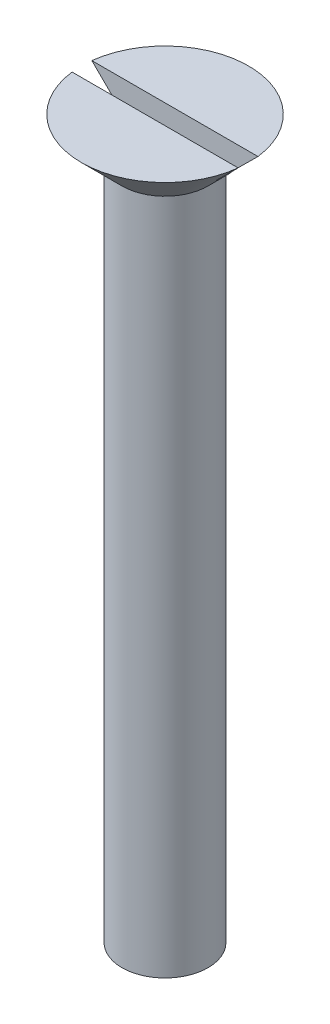
ISO-10303-21;
HEADER;
FILE_DESCRIPTION(('STEP AP214'),'2;1');
FILE_NAME('part.step','',(''),(''),'','','');
FILE_SCHEMA(('AUTOMOTIVE_DESIGN { 1 0 10303 214 1 1 1 1 }'));
ENDSEC;
DATA;
#1=APPLICATION_CONTEXT('core data for automotive mechanical design processes');
#2=APPLICATION_PROTOCOL_DEFINITION('international standard','automotive_design',2000,#1);
#3=PRODUCT_CONTEXT('',#1,'mechanical');
#4=PRODUCT('Part','Part','',(#3));
#5=PRODUCT_RELATED_PRODUCT_CATEGORY('part','',(#4));
#6=PRODUCT_DEFINITION_FORMATION('','',#4);
#7=PRODUCT_DEFINITION_CONTEXT('part definition',#1,'design');
#8=PRODUCT_DEFINITION('design','',#6,#7);
#9=PRODUCT_DEFINITION_SHAPE('','',#8);
#10=(LENGTH_UNIT() NAMED_UNIT(*) SI_UNIT(.MILLI.,.METRE.));
#11=(NAMED_UNIT(*) PLANE_ANGLE_UNIT() SI_UNIT($,.RADIAN.));
#12=(NAMED_UNIT(*) SI_UNIT($,.STERADIAN.) SOLID_ANGLE_UNIT());
#13=UNCERTAINTY_MEASURE_WITH_UNIT(LENGTH_MEASURE(1.E-05),#10,'distance_accuracy_value','');
#14=(GEOMETRIC_REPRESENTATION_CONTEXT(3) GLOBAL_UNCERTAINTY_ASSIGNED_CONTEXT((#13)) GLOBAL_UNIT_ASSIGNED_CONTEXT((#10,
#11,#12)) REPRESENTATION_CONTEXT('',''));
#15=CARTESIAN_POINT('',(0.,0.,0.));
#16=DIRECTION('',(0.,0.,1.));
#17=DIRECTION('',(1.,0.,0.));
#18=AXIS2_PLACEMENT_3D('',#15,#16,#17);
#19=CARTESIAN_POINT('',(-2.9142135623731,7.76583957863325,0.));
#20=DIRECTION('',(0.,1.,0.));
#21=DIRECTION('',(0.,0.,1.));
#22=AXIS2_PLACEMENT_3D('',#19,#20,#21);
#23=PLANE('',#22);
#24=DIRECTION('',(1.,0.,0.));
#25=VECTOR('',#24,1.);
#26=CARTESIAN_POINT('',(-2.9142135623731,7.76583957863325,0.344620739491493));
#27=LINE('',#26,#25);
#28=CARTESIAN_POINT('',(-2.89376523460899,7.76583957863325,0.344620739491493));
#29=VERTEX_POINT('',#28);
#30=CARTESIAN_POINT('',(2.89376523460899,7.76583957863325,0.344620739491493));
#31=VERTEX_POINT('',#30);
#32=EDGE_CURVE('E56',#29,#31,#27,.T.);
#33=ORIENTED_EDGE('',*,*,#32,.F.);
#34=CARTESIAN_POINT('',(0.,7.76583957863325,0.));
#35=DIRECTION('',(0.,1.,0.));
#36=DIRECTION('',(0.,0.,1.));
#37=AXIS2_PLACEMENT_3D('',#34,#35,#36);
#38=CIRCLE('',#37,2.9142135623731);
#39=EDGE_CURVE('E95',#29,#31,#38,.T.);
#40=ORIENTED_EDGE('',*,*,#39,.T.);
#41=EDGE_LOOP('',(#33,#40));
#42=FACE_BOUND('',#41,.T.);
#43=ADVANCED_FACE('F33',(#42),#23,.T.);
#44=CARTESIAN_POINT('',(0.,-17.2341604213668,0.));
#45=DIRECTION('',(0.,-1.,0.));
#46=DIRECTION('',(0.,0.,-1.));
#47=AXIS2_PLACEMENT_3D('',#44,#45,#46);
#48=PLANE('',#47);
#49=CARTESIAN_POINT('',(0.,-17.2341604213668,0.));
#50=DIRECTION('',(0.,1.,0.));
#51=DIRECTION('',(0.,0.,1.));
#52=AXIS2_PLACEMENT_3D('',#49,#50,#51);
#53=CIRCLE('',#52,1.5);
#54=CARTESIAN_POINT('',(0.,-17.2341604213668,1.5));
#55=VERTEX_POINT('',#54);
#56=EDGE_CURVE('E131',#55,#55,#53,.T.);
#57=ORIENTED_EDGE('',*,*,#56,.F.);
#58=EDGE_LOOP('',(#57));
#59=FACE_BOUND('',#58,.T.);
#60=ADVANCED_FACE('F35',(#59),#48,.T.);
#61=CARTESIAN_POINT('',(0.,17.3272357723577,0.));
#62=DIRECTION('',(0.,1.,0.));
#63=DIRECTION('',(0.,0.,1.));
#64=AXIS2_PLACEMENT_3D('',#61,#62,#63);
#65=CYLINDRICAL_SURFACE('',#64,1.5);
#66=ORIENTED_EDGE('',*,*,#56,.T.);
#67=EDGE_LOOP('',(#66));
#68=FACE_BOUND('',#67,.T.);
#69=CARTESIAN_POINT('',(0.,6.35162601626016,0.));
#70=DIRECTION('',(0.,1.,0.));
#71=DIRECTION('',(0.,0.,1.));
#72=AXIS2_PLACEMENT_3D('',#69,#70,#71);
#73=CIRCLE('',#72,1.5);
#74=CARTESIAN_POINT('',(0.,6.35162601626016,1.5));
#75=VERTEX_POINT('',#74);
#76=EDGE_CURVE('E135',#75,#75,#73,.T.);
#77=ORIENTED_EDGE('',*,*,#76,.F.);
#78=EDGE_LOOP('',(#77));
#79=FACE_BOUND('',#78,.T.);
#80=ADVANCED_FACE('F124',(#68,#79),#65,.T.);
#81=CARTESIAN_POINT('',(0.,7.76583957863325,0.));
#82=DIRECTION('',(0.,1.,0.));
#83=DIRECTION('',(0.,0.,1.));
#84=AXIS2_PLACEMENT_3D('',#81,#82,#83);
#85=CONICAL_SURFACE('',#84,2.9142135623731,0.785398163397453);
#86=CARTESIAN_POINT('',(2.89447017984621,7.76653957863325,0.344620739491493));
#87=CARTESIAN_POINT('',(2.81844223999218,7.69104632052423,0.344620739491493));
#88=CARTESIAN_POINT('',(2.74239493585646,7.61557255055868,0.344620739491493));
#89=CARTESIAN_POINT('',(2.59023078972699,7.46466292469853,0.344620739491493));
#90=CARTESIAN_POINT('',(2.51411393642163,7.38922708021032,0.344620739491493));
#91=CARTESIAN_POINT('',(2.36148803648691,7.23810338477169,0.344620739491493));
#92=CARTESIAN_POINT('',(2.2849786991598,7.16241582728227,0.344620739491493));
#93=CARTESIAN_POINT('',(2.1318825206602,7.01115127791676,0.344620739491493));
#94=CARTESIAN_POINT('',(2.05529569908681,6.93557426619622,0.344620739491493));
#95=CARTESIAN_POINT('',(1.85208689015005,6.7353732557132,0.344620739491493));
#96=CARTESIAN_POINT('',(1.72535794612297,6.61085759122406,0.344620739491493));
#97=CARTESIAN_POINT('',(1.53473606982777,6.42452254585844,0.344620739491493));
#98=CARTESIAN_POINT('',(1.47108179075449,6.36245919273218,0.344620739491493));
#99=CARTESIAN_POINT('',(1.34354407315685,6.23858036999785,0.344620739491493));
#100=CARTESIAN_POINT('',(1.27966065679947,6.17676487757488,0.344620739491493));
#101=CARTESIAN_POINT('',(1.15180646006147,6.05375567622507,0.344620739491493));
#102=CARTESIAN_POINT('',(1.08783714310636,5.99256045140276,0.344620739491493));
#103=CARTESIAN_POINT('',(0.959306406859809,5.87074957283627,0.344620739491493));
#104=CARTESIAN_POINT('',(0.8947447855358,5.81013413243568,0.344620739491493));
#105=CARTESIAN_POINT('',(0.764740728327586,5.69004474045051,0.344620739491493));
#106=CARTESIAN_POINT('',(0.699299820761315,5.63056915818346,0.344620739491493));
#107=CARTESIAN_POINT('',(0.599654524988886,5.54307843619466,0.344620739491493));
#108=CARTESIAN_POINT('',(0.566201849409562,5.51420995323607,0.344620739491493));
#109=CARTESIAN_POINT('',(0.498529262510903,5.45738988563101,0.344620739491493));
#110=CARTESIAN_POINT('',(0.464309533985106,5.42943808636276,0.344620739491493));
#111=CARTESIAN_POINT('',(0.416569751318667,5.39220923382768,0.344620739491493));
#112=CARTESIAN_POINT('',(0.403580475545754,5.38225360505871,0.344620739491493));
#113=CARTESIAN_POINT('',(0.377393583124588,5.36261942142332,0.344620739491493));
#114=CARTESIAN_POINT('',(0.36419595061982,5.35294088780384,0.344620739491493));
#115=CARTESIAN_POINT('',(0.324158254394182,5.32437178156682,0.344620739491493));
#116=CARTESIAN_POINT('',(0.296937800579717,5.30599892066931,0.344620739491493));
#117=CARTESIAN_POINT('',(0.242051155077484,5.27221745387556,0.344620739491493));
#118=CARTESIAN_POINT('',(0.214437157700769,5.25672535717064,0.344620739491493));
#119=CARTESIAN_POINT('',(0.157372052552978,5.22965872717838,0.344620739491493));
#120=CARTESIAN_POINT('',(0.127931920859653,5.21806305180342,0.344620739491493));
#121=CARTESIAN_POINT('',(0.0876375513141441,5.20708715200257,0.344620739491493));
#122=CARTESIAN_POINT('',(0.0775954677277507,5.2047357201441,0.344620739491493));
#123=CARTESIAN_POINT('',(0.0573542232099183,5.20084475066641,0.344620739491493));
#124=CARTESIAN_POINT('',(0.0471550411498494,5.19930532325483,0.344620739491493));
#125=CARTESIAN_POINT('',(0.0164771267025976,5.19604854801269,0.344620739491493));
#126=CARTESIAN_POINT('',(-0.00416504242912009,5.19566879762009,0.344620739491493));
#127=CARTESIAN_POINT('',(-0.0451204590196041,5.19858459975008,0.344620739491493));
#128=CARTESIAN_POINT('',(-0.0654342895652853,5.20187268637347,0.344620739491493));
#129=CARTESIAN_POINT('',(-0.105393153238249,5.21147497708921,0.344620739491493));
#130=CARTESIAN_POINT('',(-0.12503470867214,5.21780293147634,0.344620739491493));
#131=CARTESIAN_POINT('',(-0.169847621462504,5.23509767477817,0.344620739491493));
#132=CARTESIAN_POINT('',(-0.194682853971842,5.2469074678488,0.344620739491493));
#133=CARTESIAN_POINT('',(-0.243115731335561,5.27287467319928,0.344620739491493));
#134=CARTESIAN_POINT('',(-0.266710152108928,5.28703783850085,0.344620739491493));
#135=CARTESIAN_POINT('',(-0.313128467106842,5.31691760847332,0.344620739491493));
#136=CARTESIAN_POINT('',(-0.335945325359459,5.33264498342064,0.344620739491493));
#137=CARTESIAN_POINT('',(-0.380862210601318,5.36502489584996,0.344620739491493));
#138=CARTESIAN_POINT('',(-0.402963066453176,5.38167629827657,0.344620739491493));
#139=CARTESIAN_POINT('',(-0.449494343705841,5.41781213373035,0.344620739491493));
#140=CARTESIAN_POINT('',(-0.473856187603684,5.43738436186925,0.344620739491493));
#141=CARTESIAN_POINT('',(-0.522127390659865,5.47708074215654,0.344620739491493));
#142=CARTESIAN_POINT('',(-0.546036700615757,5.49720495374418,0.344620739491493));
#143=CARTESIAN_POINT('',(-0.617289888200942,5.55816529898879,0.344620739491493));
#144=CARTESIAN_POINT('',(-0.664141524704569,5.59957512255755,0.344620739491493));
#145=CARTESIAN_POINT('',(-0.757161014420026,5.68328279399654,0.344620739491493));
#146=CARTESIAN_POINT('',(-0.803327762173639,5.72558185689852,0.344620739491493));
#147=CARTESIAN_POINT('',(-0.895171595755615,5.81068787436486,0.344620739491493));
#148=CARTESIAN_POINT('',(-0.940848785544149,5.85349471686219,0.344620739491493));
#149=CARTESIAN_POINT('',(-1.07697485198279,5.98199355380316,0.344620739491493));
#150=CARTESIAN_POINT('',(-1.16696331203829,6.06817203389904,0.344620739491493));
#151=CARTESIAN_POINT('',(-1.34626004480336,6.24110099360754,0.344620739491493));
#152=CARTESIAN_POINT('',(-1.43556876298007,6.32785101369007,0.344620739491493));
#153=CARTESIAN_POINT('',(-1.63930462731398,6.52656991972356,0.344620739491493));
#154=CARTESIAN_POINT('',(-1.75361434497793,6.63865916492138,0.344620739491493));
#155=CARTESIAN_POINT('',(-1.98193838436452,6.86319892898583,0.344620739491493));
#156=CARTESIAN_POINT('',(-2.09595261816592,6.97564953708281,0.344620739491493));
#157=CARTESIAN_POINT('',(-2.3241424473368,7.20111277038613,0.344620739491493));
#158=CARTESIAN_POINT('',(-2.43831740082936,7.31412604510354,0.344620739491493));
#159=CARTESIAN_POINT('',(-2.66649723095002,7.54026044758722,0.344620739491493));
#160=CARTESIAN_POINT('',(-2.78050214619567,7.65338153637919,0.344620739491493));
#161=CARTESIAN_POINT('',(-2.89447017984621,7.76653957863325,0.344620739491493));
#162=B_SPLINE_CURVE_WITH_KNOTS('',3,(#86,#87,#88,#89,#90,#91,#92,#93,#94,#95,#96,#97,#98,#99,
#100,#101,#102,#103,#104,#105,#106,#107,#108,#109,#110,#111,#112,#113,#114,#115,#116,#117,#118,
#119,#120,#121,#122,#123,#124,#125,#126,#127,#128,#129,#130,#131,#132,#133,#134,#135,#136,#137,
#138,#139,#140,#141,#142,#143,#144,#145,#146,#147,#148,#149,#150,#151,#152,#153,#154,#155,#156,
#157,#158,#159,#160,#161),.UNSPECIFIED.,.F.,.F.,(4,2,2,2,2,2,2,2,2,2,2,2,2,2,2,2,2,2,2,2,2,2,2,
2,2,2,2,2,2,2,2,2,2,2,2,2,2,4),(0.,0.321427008669999,0.642922051870406,0.965785040520727,
1.28858037749753,1.82156981332287,2.08827806151935,2.35496116885723,2.62053726814024,
2.88620759737341,3.15146418551878,3.28401694460448,3.41653844447756,3.46563195888717,
3.51472922763085,3.61317044985723,3.70803232927672,3.80237084487895,3.83328159926134,
3.86419654786343,3.92577051919589,3.98721938476096,4.04894885853078,4.13123029360537,
4.21371591464452,4.29681502411989,4.37981422369493,4.47355250599491,4.56730092225542,
4.75486498462356,4.94270455041212,5.13050340401877,5.50428960461212,5.87780506076009,
6.35809129092043,6.83850697126596,7.3204521183816,7.8022625597577),.UNSPECIFIED.);
#163=CARTESIAN_POINT('',(-2.08580996602368,6.96571368436936,0.344620739491493));
#164=VERTEX_POINT('',#163);
#165=EDGE_CURVE('E81',#164,#29,#162,.T.);
#166=ORIENTED_EDGE('',*,*,#165,.F.);
#167=CARTESIAN_POINT('',(0.,6.96571368436936,0.));
#168=DIRECTION('',(0.,-1.,0.));
#169=DIRECTION('',(0.,0.,-1.));
#170=AXIS2_PLACEMENT_3D('',#167,#168,#169);
#171=CIRCLE('',#170,2.11408766810919);
#172=CARTESIAN_POINT('',(-2.08580996602368,6.96571368436936,-0.344620739491493));
#173=VERTEX_POINT('',#172);
#174=EDGE_CURVE('E11',#173,#164,#171,.F.);
#175=ORIENTED_EDGE('',*,*,#174,.F.);
#176=CARTESIAN_POINT('',(-2.89447017984621,7.76653957863325,-0.344620739491493));
#177=CARTESIAN_POINT('',(-2.81844223999218,7.69104632052423,-0.344620739491493));
#178=CARTESIAN_POINT('',(-2.74239493585646,7.61557255055868,-0.344620739491493));
#179=CARTESIAN_POINT('',(-2.59023078972699,7.46466292469853,-0.344620739491493));
#180=CARTESIAN_POINT('',(-2.51411393642163,7.38922708021032,-0.344620739491493));
#181=CARTESIAN_POINT('',(-2.36148803648691,7.23810338477169,-0.344620739491493));
#182=CARTESIAN_POINT('',(-2.2849786991598,7.16241582728227,-0.344620739491493));
#183=CARTESIAN_POINT('',(-2.1318825206602,7.01115127791676,-0.344620739491493));
#184=CARTESIAN_POINT('',(-2.05529569908681,6.93557426619622,-0.344620739491493));
#185=CARTESIAN_POINT('',(-1.85208689015005,6.7353732557132,-0.344620739491493));
#186=CARTESIAN_POINT('',(-1.72535794612297,6.61085759122406,-0.344620739491493));
#187=CARTESIAN_POINT('',(-1.53473606982777,6.42452254585844,-0.344620739491493));
#188=CARTESIAN_POINT('',(-1.47108179075449,6.36245919273218,-0.344620739491493));
#189=CARTESIAN_POINT('',(-1.34354407315685,6.23858036999785,-0.344620739491493));
#190=CARTESIAN_POINT('',(-1.27966065679947,6.17676487757488,-0.344620739491493));
#191=CARTESIAN_POINT('',(-1.15180646006147,6.05375567622507,-0.344620739491493));
#192=CARTESIAN_POINT('',(-1.08783714310636,5.99256045140276,-0.344620739491493));
#193=CARTESIAN_POINT('',(-0.959306406859809,5.87074957283627,-0.344620739491493));
#194=CARTESIAN_POINT('',(-0.8947447855358,5.81013413243568,-0.344620739491493));
#195=CARTESIAN_POINT('',(-0.764740728327586,5.69004474045051,-0.344620739491493));
#196=CARTESIAN_POINT('',(-0.699299820761315,5.63056915818346,-0.344620739491493));
#197=CARTESIAN_POINT('',(-0.599654524988886,5.54307843619466,-0.344620739491493));
#198=CARTESIAN_POINT('',(-0.566201849409562,5.51420995323607,-0.344620739491493));
#199=CARTESIAN_POINT('',(-0.498529262510903,5.45738988563101,-0.344620739491493));
#200=CARTESIAN_POINT('',(-0.464309533985106,5.42943808636276,-0.344620739491493));
#201=CARTESIAN_POINT('',(-0.416569751318667,5.39220923382768,-0.344620739491493));
#202=CARTESIAN_POINT('',(-0.403580475545754,5.38225360505871,-0.344620739491493));
#203=CARTESIAN_POINT('',(-0.377393583124588,5.36261942142332,-0.344620739491493));
#204=CARTESIAN_POINT('',(-0.36419595061982,5.35294088780384,-0.344620739491493));
#205=CARTESIAN_POINT('',(-0.324158254394182,5.32437178156682,-0.344620739491493));
#206=CARTESIAN_POINT('',(-0.296937800579717,5.30599892066931,-0.344620739491493));
#207=CARTESIAN_POINT('',(-0.242051155077484,5.27221745387556,-0.344620739491493));
#208=CARTESIAN_POINT('',(-0.214437157700769,5.25672535717064,-0.344620739491493));
#209=CARTESIAN_POINT('',(-0.157372052552978,5.22965872717838,-0.344620739491493));
#210=CARTESIAN_POINT('',(-0.127931920859653,5.21806305180342,-0.344620739491493));
#211=CARTESIAN_POINT('',(-0.0876375513141441,5.20708715200257,-0.344620739491493));
#212=CARTESIAN_POINT('',(-0.0775954677277507,5.2047357201441,-0.344620739491493));
#213=CARTESIAN_POINT('',(-0.0573542232099183,5.20084475066641,-0.344620739491493));
#214=CARTESIAN_POINT('',(-0.0471550411498494,5.19930532325483,-0.344620739491493));
#215=CARTESIAN_POINT('',(-0.0164771267025976,5.19604854801269,-0.344620739491493));
#216=CARTESIAN_POINT('',(0.00416504242912009,5.19566879762009,-0.344620739491493));
#217=CARTESIAN_POINT('',(0.0451204590196041,5.19858459975008,-0.344620739491493));
#218=CARTESIAN_POINT('',(0.0654342895652853,5.20187268637347,-0.344620739491493));
#219=CARTESIAN_POINT('',(0.105393153238249,5.21147497708921,-0.344620739491493));
#220=CARTESIAN_POINT('',(0.12503470867214,5.21780293147634,-0.344620739491493));
#221=CARTESIAN_POINT('',(0.169847621462504,5.23509767477817,-0.344620739491493));
#222=CARTESIAN_POINT('',(0.194682853971842,5.2469074678488,-0.344620739491493));
#223=CARTESIAN_POINT('',(0.243115731335561,5.27287467319928,-0.344620739491493));
#224=CARTESIAN_POINT('',(0.266710152108928,5.28703783850085,-0.344620739491493));
#225=CARTESIAN_POINT('',(0.313128467106842,5.31691760847332,-0.344620739491493));
#226=CARTESIAN_POINT('',(0.335945325359459,5.33264498342064,-0.344620739491493));
#227=CARTESIAN_POINT('',(0.380862210601318,5.36502489584996,-0.344620739491493));
#228=CARTESIAN_POINT('',(0.402963066453176,5.38167629827657,-0.344620739491493));
#229=CARTESIAN_POINT('',(0.449494343705841,5.41781213373035,-0.344620739491493));
#230=CARTESIAN_POINT('',(0.473856187603684,5.43738436186925,-0.344620739491493));
#231=CARTESIAN_POINT('',(0.522127390659865,5.47708074215654,-0.344620739491493));
#232=CARTESIAN_POINT('',(0.546036700615757,5.49720495374418,-0.344620739491493));
#233=CARTESIAN_POINT('',(0.617289888200942,5.55816529898879,-0.344620739491493));
#234=CARTESIAN_POINT('',(0.664141524704569,5.59957512255755,-0.344620739491493));
#235=CARTESIAN_POINT('',(0.757161014420026,5.68328279399654,-0.344620739491493));
#236=CARTESIAN_POINT('',(0.803327762173639,5.72558185689852,-0.344620739491493));
#237=CARTESIAN_POINT('',(0.895171595755615,5.81068787436486,-0.344620739491493));
#238=CARTESIAN_POINT('',(0.940848785544149,5.85349471686219,-0.344620739491493));
#239=CARTESIAN_POINT('',(1.07697485198279,5.98199355380316,-0.344620739491493));
#240=CARTESIAN_POINT('',(1.16696331203829,6.06817203389904,-0.344620739491493));
#241=CARTESIAN_POINT('',(1.34626004480336,6.24110099360754,-0.344620739491493));
#242=CARTESIAN_POINT('',(1.43556876298007,6.32785101369007,-0.344620739491493));
#243=CARTESIAN_POINT('',(1.63930462731398,6.52656991972356,-0.344620739491493));
#244=CARTESIAN_POINT('',(1.75361434497793,6.63865916492138,-0.344620739491493));
#245=CARTESIAN_POINT('',(1.98193838436452,6.86319892898583,-0.344620739491493));
#246=CARTESIAN_POINT('',(2.09595261816592,6.97564953708281,-0.344620739491493));
#247=CARTESIAN_POINT('',(2.3241424473368,7.20111277038613,-0.344620739491493));
#248=CARTESIAN_POINT('',(2.43831740082936,7.31412604510354,-0.344620739491493));
#249=CARTESIAN_POINT('',(2.66649723095002,7.54026044758722,-0.344620739491493));
#250=CARTESIAN_POINT('',(2.78050214619567,7.65338153637919,-0.344620739491493));
#251=CARTESIAN_POINT('',(2.89447017984621,7.76653957863325,-0.344620739491493));
#252=B_SPLINE_CURVE_WITH_KNOTS('',3,(#176,#177,#178,#179,#180,#181,#182,#183,#184,#185,#186,
#187,#188,#189,#190,#191,#192,#193,#194,#195,#196,#197,#198,#199,#200,#201,#202,#203,#204,#205,
#206,#207,#208,#209,#210,#211,#212,#213,#214,#215,#216,#217,#218,#219,#220,#221,#222,#223,#224,
#225,#226,#227,#228,#229,#230,#231,#232,#233,#234,#235,#236,#237,#238,#239,#240,#241,#242,#243,
#244,#245,#246,#247,#248,#249,#250,#251),.UNSPECIFIED.,.F.,.F.,(4,2,2,2,2,2,2,2,2,2,2,2,2,2,2,2,
2,2,2,2,2,2,2,2,2,2,2,2,2,2,2,2,2,2,2,2,2,4),(0.,0.321427008669999,0.642922051870406,
0.965785040520727,1.28858037749753,1.82156981332287,2.08827806151935,2.35496116885723,
2.62053726814024,2.88620759737341,3.15146418551878,3.28401694460448,3.41653844447756,
3.46563195888717,3.51472922763085,3.61317044985723,3.70803232927672,3.80237084487895,
3.83328159926134,3.86419654786343,3.92577051919589,3.98721938476096,4.04894885853078,
4.13123029360537,4.21371591464452,4.29681502411989,4.37981422369493,4.47355250599491,
4.56730092225542,4.75486498462356,4.94270455041212,5.13050340401877,5.50428960461212,
5.87780506076009,6.35809129092043,6.83850697126596,7.3204521183816,7.8022625597577),.UNSPECIFIED.);
#253=CARTESIAN_POINT('',(-2.89376523460899,7.76583957863325,-0.344620739491493));
#254=VERTEX_POINT('',#253);
#255=EDGE_CURVE('E72',#254,#173,#252,.T.);
#256=ORIENTED_EDGE('',*,*,#255,.F.);
#257=CARTESIAN_POINT('',(2.89376523460899,7.76583957863325,-0.344620739491493));
#258=VERTEX_POINT('',#257);
#259=EDGE_CURVE('E137',#258,#254,#38,.T.);
#260=ORIENTED_EDGE('',*,*,#259,.F.);
#261=CARTESIAN_POINT('',(2.08580996602368,6.96571368436936,-0.344620739491493));
#262=VERTEX_POINT('',#261);
#263=EDGE_CURVE('E48',#262,#258,#252,.T.);
#264=ORIENTED_EDGE('',*,*,#263,.F.);
#265=CARTESIAN_POINT('',(2.08580996602368,6.96571368436936,0.344620739491493));
#266=VERTEX_POINT('',#265);
#267=EDGE_CURVE('E37',#266,#262,#171,.F.);
#268=ORIENTED_EDGE('',*,*,#267,.F.);
#269=EDGE_CURVE('E96',#31,#266,#162,.T.);
#270=ORIENTED_EDGE('',*,*,#269,.F.);
#271=ORIENTED_EDGE('',*,*,#39,.F.);
#272=EDGE_LOOP('',(#166,#175,#256,#260,#264,#268,#270,#271));
#273=FACE_BOUND('',#272,.T.);
#274=ORIENTED_EDGE('',*,*,#76,.T.);
#275=EDGE_LOOP('',(#274));
#276=FACE_BOUND('',#275,.T.);
#277=ADVANCED_FACE('F91',(#273,#276),#85,.T.);
#278=DIRECTION('',(-1.,0.,0.));
#279=VECTOR('',#278,1.);
#280=CARTESIAN_POINT('',(-2.9142135623731,7.76583957863325,-0.344620739491493));
#281=LINE('',#280,#279);
#282=EDGE_CURVE('E76',#258,#254,#281,.T.);
#283=ORIENTED_EDGE('',*,*,#282,.F.);
#284=ORIENTED_EDGE('',*,*,#259,.T.);
#285=EDGE_LOOP('',(#283,#284));
#286=FACE_BOUND('',#285,.T.);
#287=ADVANCED_FACE('F118',(#286),#23,.T.);
#288=CARTESIAN_POINT('',(-2.9142135623731,8.56596547289715,0.344620739491493));
#289=DIRECTION('',(0.,0.,1.));
#290=DIRECTION('',(1.,0.,0.));
#291=AXIS2_PLACEMENT_3D('',#288,#289,#290);
#292=PLANE('',#291);
#293=ORIENTED_EDGE('',*,*,#269,.T.);
#294=DIRECTION('',(1.,0.,0.));
#295=VECTOR('',#294,1.);
#296=CARTESIAN_POINT('',(-2.9142135623731,6.96571368436936,0.344620739491493));
#297=LINE('',#296,#295);
#298=EDGE_CURVE('E88',#164,#266,#297,.T.);
#299=ORIENTED_EDGE('',*,*,#298,.F.);
#300=ORIENTED_EDGE('',*,*,#165,.T.);
#301=ORIENTED_EDGE('',*,*,#32,.T.);
#302=EDGE_LOOP('',(#293,#299,#300,#301));
#303=FACE_BOUND('',#302,.T.);
#304=ADVANCED_FACE('F114',(#303),#292,.F.);
#305=CARTESIAN_POINT('',(-2.9142135623731,8.56596547289715,-0.344620739491493));
#306=DIRECTION('',(0.,0.,-1.));
#307=DIRECTION('',(-1.,0.,0.));
#308=AXIS2_PLACEMENT_3D('',#305,#306,#307);
#309=PLANE('',#308);
#310=ORIENTED_EDGE('',*,*,#255,.T.);
#311=DIRECTION('',(1.,0.,0.));
#312=VECTOR('',#311,1.);
#313=CARTESIAN_POINT('',(-2.9142135623731,6.96571368436936,-0.344620739491493));
#314=LINE('',#313,#312);
#315=EDGE_CURVE('E75',#173,#262,#314,.T.);
#316=ORIENTED_EDGE('',*,*,#315,.T.);
#317=ORIENTED_EDGE('',*,*,#263,.T.);
#318=ORIENTED_EDGE('',*,*,#282,.T.);
#319=EDGE_LOOP('',(#310,#316,#317,#318));
#320=FACE_BOUND('',#319,.T.);
#321=ADVANCED_FACE('F74',(#320),#309,.F.);
#322=CARTESIAN_POINT('',(-2.9142135623731,6.96571368436936,-0.344620739491493));
#323=DIRECTION('',(0.,-1.,0.));
#324=DIRECTION('',(0.,0.,-1.));
#325=AXIS2_PLACEMENT_3D('',#322,#323,#324);
#326=PLANE('',#325);
#327=ORIENTED_EDGE('',*,*,#174,.T.);
#328=ORIENTED_EDGE('',*,*,#298,.T.);
#329=ORIENTED_EDGE('',*,*,#267,.T.);
#330=ORIENTED_EDGE('',*,*,#315,.F.);
#331=EDGE_LOOP('',(#327,#328,#329,#330));
#332=FACE_BOUND('',#331,.T.);
#333=ADVANCED_FACE('F84',(#332),#326,.F.);
#334=CLOSED_SHELL('',(#43,#60,#80,#277,#287,#304,#321,#333));
#335=MANIFOLD_SOLID_BREP('B2',#334);
#336=ADVANCED_BREP_SHAPE_REPRESENTATION('',(#18,#335),#14);
#337=SHAPE_DEFINITION_REPRESENTATION(#9,#336);
ENDSEC;
END-ISO-10303-21;
